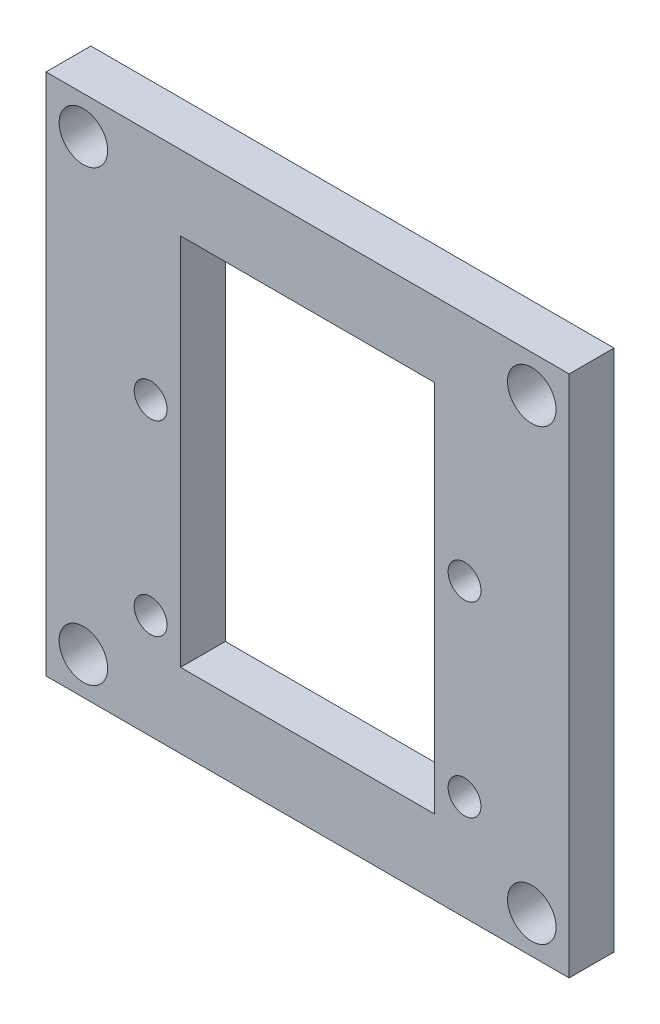
ISO-10303-21;
HEADER;
FILE_DESCRIPTION(('STEP AP214'),'2;1');
FILE_NAME('part.step','',(''),(''),'','','');
FILE_SCHEMA(('AUTOMOTIVE_DESIGN { 1 0 10303 214 1 1 1 1 }'));
ENDSEC;
DATA;
#1=APPLICATION_CONTEXT('core data for automotive mechanical design processes');
#2=APPLICATION_PROTOCOL_DEFINITION('international standard','automotive_design',2000,#1);
#3=PRODUCT_CONTEXT('',#1,'mechanical');
#4=PRODUCT('Part','Part','',(#3));
#5=PRODUCT_RELATED_PRODUCT_CATEGORY('part','',(#4));
#6=PRODUCT_DEFINITION_FORMATION('','',#4);
#7=PRODUCT_DEFINITION_CONTEXT('part definition',#1,'design');
#8=PRODUCT_DEFINITION('design','',#6,#7);
#9=PRODUCT_DEFINITION_SHAPE('','',#8);
#10=(LENGTH_UNIT() NAMED_UNIT(*) SI_UNIT(.MILLI.,.METRE.));
#11=(NAMED_UNIT(*) PLANE_ANGLE_UNIT() SI_UNIT($,.RADIAN.));
#12=(NAMED_UNIT(*) SI_UNIT($,.STERADIAN.) SOLID_ANGLE_UNIT());
#13=UNCERTAINTY_MEASURE_WITH_UNIT(LENGTH_MEASURE(1.E-05),#10,'distance_accuracy_value','');
#14=(GEOMETRIC_REPRESENTATION_CONTEXT(3) GLOBAL_UNCERTAINTY_ASSIGNED_CONTEXT((#13)) GLOBAL_UNIT_ASSIGNED_CONTEXT((#10,
#11,#12)) REPRESENTATION_CONTEXT('',''));
#15=CARTESIAN_POINT('',(0.,0.,0.));
#16=DIRECTION('',(0.,0.,1.));
#17=DIRECTION('',(1.,0.,0.));
#18=AXIS2_PLACEMENT_3D('',#15,#16,#17);
#19=CARTESIAN_POINT('',(0.,-5.,3.));
#20=DIRECTION('',(0.,1.,0.));
#21=DIRECTION('',(0.,0.,1.));
#22=AXIS2_PLACEMENT_3D('',#19,#20,#21);
#23=PLANE('',#22);
#24=DIRECTION('',(1.,0.,0.));
#25=VECTOR('',#24,1.);
#26=CARTESIAN_POINT('',(0.,-5.,0.));
#27=LINE('',#26,#25);
#28=CARTESIAN_POINT('',(-5.,-5.,0.));
#29=VERTEX_POINT('',#28);
#30=CARTESIAN_POINT('',(30.,-5.,0.));
#31=VERTEX_POINT('',#30);
#32=EDGE_CURVE('E196',#29,#31,#27,.T.);
#33=ORIENTED_EDGE('',*,*,#32,.T.);
#34=DIRECTION('',(0.,0.,-1.));
#35=VECTOR('',#34,1.);
#36=CARTESIAN_POINT('',(30.,-5.,3.));
#37=LINE('',#36,#35);
#38=CARTESIAN_POINT('',(30.,-5.,3.));
#39=VERTEX_POINT('',#38);
#40=EDGE_CURVE('E11',#39,#31,#37,.T.);
#41=ORIENTED_EDGE('',*,*,#40,.F.);
#42=DIRECTION('',(1.,0.,0.));
#43=VECTOR('',#42,1.);
#44=CARTESIAN_POINT('',(0.,-5.,3.));
#45=LINE('',#44,#43);
#46=CARTESIAN_POINT('',(-5.,-5.,3.));
#47=VERTEX_POINT('',#46);
#48=EDGE_CURVE('E128',#47,#39,#45,.T.);
#49=ORIENTED_EDGE('',*,*,#48,.F.);
#50=DIRECTION('',(0.,0.,-1.));
#51=VECTOR('',#50,1.);
#52=CARTESIAN_POINT('',(-5.,-5.,3.));
#53=LINE('',#52,#51);
#54=EDGE_CURVE('E67',#47,#29,#53,.T.);
#55=ORIENTED_EDGE('',*,*,#54,.T.);
#56=EDGE_LOOP('',(#33,#41,#49,#55));
#57=FACE_BOUND('',#56,.T.);
#58=ADVANCED_FACE('F47',(#57),#23,.F.);
#59=CARTESIAN_POINT('',(30.,0.,3.));
#60=DIRECTION('',(-1.,0.,0.));
#61=DIRECTION('',(0.,0.,1.));
#62=AXIS2_PLACEMENT_3D('',#59,#60,#61);
#63=PLANE('',#62);
#64=DIRECTION('',(0.,1.,0.));
#65=VECTOR('',#64,1.);
#66=CARTESIAN_POINT('',(30.,0.,0.));
#67=LINE('',#66,#65);
#68=CARTESIAN_POINT('',(30.,30.,0.));
#69=VERTEX_POINT('',#68);
#70=EDGE_CURVE('E135',#31,#69,#67,.T.);
#71=ORIENTED_EDGE('',*,*,#70,.T.);
#72=DIRECTION('',(0.,0.,-1.));
#73=VECTOR('',#72,1.);
#74=CARTESIAN_POINT('',(30.,30.,3.));
#75=LINE('',#74,#73);
#76=CARTESIAN_POINT('',(30.,30.,3.));
#77=VERTEX_POINT('',#76);
#78=EDGE_CURVE('E58',#77,#69,#75,.T.);
#79=ORIENTED_EDGE('',*,*,#78,.F.);
#80=DIRECTION('',(0.,1.,0.));
#81=VECTOR('',#80,1.);
#82=CARTESIAN_POINT('',(30.,0.,3.));
#83=LINE('',#82,#81);
#84=EDGE_CURVE('E121',#39,#77,#83,.T.);
#85=ORIENTED_EDGE('',*,*,#84,.F.);
#86=ORIENTED_EDGE('',*,*,#40,.T.);
#87=EDGE_LOOP('',(#71,#79,#85,#86));
#88=FACE_BOUND('',#87,.T.);
#89=ADVANCED_FACE('F134',(#88),#63,.F.);
#90=CARTESIAN_POINT('',(0.,30.,3.));
#91=DIRECTION('',(0.,1.,0.));
#92=DIRECTION('',(0.,0.,1.));
#93=AXIS2_PLACEMENT_3D('',#90,#91,#92);
#94=PLANE('',#93);
#95=DIRECTION('',(1.,0.,0.));
#96=VECTOR('',#95,1.);
#97=CARTESIAN_POINT('',(0.,30.,0.));
#98=LINE('',#97,#96);
#99=CARTESIAN_POINT('',(-5.,30.,0.));
#100=VERTEX_POINT('',#99);
#101=EDGE_CURVE('E201',#100,#69,#98,.T.);
#102=ORIENTED_EDGE('',*,*,#101,.F.);
#103=DIRECTION('',(0.,0.,-1.));
#104=VECTOR('',#103,1.);
#105=CARTESIAN_POINT('',(-5.,30.,3.));
#106=LINE('',#105,#104);
#107=CARTESIAN_POINT('',(-5.,30.,3.));
#108=VERTEX_POINT('',#107);
#109=EDGE_CURVE('E93',#108,#100,#106,.T.);
#110=ORIENTED_EDGE('',*,*,#109,.F.);
#111=DIRECTION('',(1.,0.,0.));
#112=VECTOR('',#111,1.);
#113=CARTESIAN_POINT('',(0.,30.,3.));
#114=LINE('',#113,#112);
#115=EDGE_CURVE('E127',#108,#77,#114,.T.);
#116=ORIENTED_EDGE('',*,*,#115,.T.);
#117=ORIENTED_EDGE('',*,*,#78,.T.);
#118=EDGE_LOOP('',(#102,#110,#116,#117));
#119=FACE_BOUND('',#118,.T.);
#120=ADVANCED_FACE('F140',(#119),#94,.T.);
#121=CARTESIAN_POINT('',(0.,0.,3.));
#122=DIRECTION('',(0.,1.,0.));
#123=DIRECTION('',(-1.,0.,0.));
#124=AXIS2_PLACEMENT_3D('',#121,#122,#123);
#125=PLANE('',#124);
#126=DIRECTION('',(1.,0.,0.));
#127=VECTOR('',#126,1.);
#128=CARTESIAN_POINT('',(0.,0.,0.));
#129=LINE('',#128,#127);
#130=CARTESIAN_POINT('',(4.,0.,0.));
#131=VERTEX_POINT('',#130);
#132=CARTESIAN_POINT('',(21.,0.,0.));
#133=VERTEX_POINT('',#132);
#134=EDGE_CURVE('E165',#131,#133,#129,.T.);
#135=ORIENTED_EDGE('',*,*,#134,.F.);
#136=DIRECTION('',(0.,0.,-1.));
#137=VECTOR('',#136,1.);
#138=CARTESIAN_POINT('',(4.,0.,3.));
#139=LINE('',#138,#137);
#140=CARTESIAN_POINT('',(4.,0.,3.));
#141=VERTEX_POINT('',#140);
#142=EDGE_CURVE('E51',#141,#131,#139,.T.);
#143=ORIENTED_EDGE('',*,*,#142,.F.);
#144=DIRECTION('',(1.,0.,0.));
#145=VECTOR('',#144,1.);
#146=CARTESIAN_POINT('',(0.,0.,3.));
#147=LINE('',#146,#145);
#148=CARTESIAN_POINT('',(21.,0.,3.));
#149=VERTEX_POINT('',#148);
#150=EDGE_CURVE('E224',#141,#149,#147,.T.);
#151=ORIENTED_EDGE('',*,*,#150,.T.);
#152=DIRECTION('',(0.,0.,-1.));
#153=VECTOR('',#152,1.);
#154=CARTESIAN_POINT('',(21.,0.,3.));
#155=LINE('',#154,#153);
#156=EDGE_CURVE('E164',#149,#133,#155,.T.);
#157=ORIENTED_EDGE('',*,*,#156,.T.);
#158=EDGE_LOOP('',(#135,#143,#151,#157));
#159=FACE_BOUND('',#158,.T.);
#160=ADVANCED_FACE('F49',(#159),#125,.T.);
#161=CARTESIAN_POINT('',(4.,0.,3.));
#162=DIRECTION('',(1.,0.,0.));
#163=DIRECTION('',(0.,1.,0.));
#164=AXIS2_PLACEMENT_3D('',#161,#162,#163);
#165=PLANE('',#164);
#166=DIRECTION('',(0.,-1.,0.));
#167=VECTOR('',#166,1.);
#168=CARTESIAN_POINT('',(4.,0.,0.));
#169=LINE('',#168,#167);
#170=CARTESIAN_POINT('',(4.,25.,0.));
#171=VERTEX_POINT('',#170);
#172=EDGE_CURVE('E169',#171,#131,#169,.T.);
#173=ORIENTED_EDGE('',*,*,#172,.F.);
#174=DIRECTION('',(0.,0.,-1.));
#175=VECTOR('',#174,1.);
#176=CARTESIAN_POINT('',(4.,25.,3.));
#177=LINE('',#176,#175);
#178=CARTESIAN_POINT('',(4.,25.,3.));
#179=VERTEX_POINT('',#178);
#180=EDGE_CURVE('E234',#179,#171,#177,.T.);
#181=ORIENTED_EDGE('',*,*,#180,.F.);
#182=DIRECTION('',(0.,-1.,0.));
#183=VECTOR('',#182,1.);
#184=CARTESIAN_POINT('',(4.,0.,3.));
#185=LINE('',#184,#183);
#186=EDGE_CURVE('E245',#179,#141,#185,.T.);
#187=ORIENTED_EDGE('',*,*,#186,.T.);
#188=ORIENTED_EDGE('',*,*,#142,.T.);
#189=EDGE_LOOP('',(#173,#181,#187,#188));
#190=FACE_BOUND('',#189,.T.);
#191=ADVANCED_FACE('F243',(#190),#165,.T.);
#192=CARTESIAN_POINT('',(0.,25.,3.));
#193=DIRECTION('',(0.,1.,0.));
#194=DIRECTION('',(-1.,0.,0.));
#195=AXIS2_PLACEMENT_3D('',#192,#193,#194);
#196=PLANE('',#195);
#197=DIRECTION('',(1.,0.,0.));
#198=VECTOR('',#197,1.);
#199=CARTESIAN_POINT('',(0.,25.,0.));
#200=LINE('',#199,#198);
#201=CARTESIAN_POINT('',(21.,25.,0.));
#202=VERTEX_POINT('',#201);
#203=EDGE_CURVE('E173',#171,#202,#200,.T.);
#204=ORIENTED_EDGE('',*,*,#203,.T.);
#205=DIRECTION('',(0.,0.,-1.));
#206=VECTOR('',#205,1.);
#207=CARTESIAN_POINT('',(21.,25.,3.));
#208=LINE('',#207,#206);
#209=CARTESIAN_POINT('',(21.,25.,3.));
#210=VERTEX_POINT('',#209);
#211=EDGE_CURVE('E231',#210,#202,#208,.T.);
#212=ORIENTED_EDGE('',*,*,#211,.F.);
#213=DIRECTION('',(1.,0.,0.));
#214=VECTOR('',#213,1.);
#215=CARTESIAN_POINT('',(0.,25.,3.));
#216=LINE('',#215,#214);
#217=EDGE_CURVE('E260',#179,#210,#216,.T.);
#218=ORIENTED_EDGE('',*,*,#217,.F.);
#219=ORIENTED_EDGE('',*,*,#180,.T.);
#220=EDGE_LOOP('',(#204,#212,#218,#219));
#221=FACE_BOUND('',#220,.T.);
#222=ADVANCED_FACE('F252',(#221),#196,.F.);
#223=CARTESIAN_POINT('',(2.,2.,3.));
#224=DIRECTION('',(0.,0.,-1.));
#225=DIRECTION('',(-1.,0.,0.));
#226=AXIS2_PLACEMENT_3D('',#223,#224,#225);
#227=CYLINDRICAL_SURFACE('',#226,1.1);
#228=CARTESIAN_POINT('',(2.,2.,3.));
#229=DIRECTION('',(0.,0.,1.));
#230=DIRECTION('',(1.,0.,0.));
#231=AXIS2_PLACEMENT_3D('',#228,#229,#230);
#232=CIRCLE('',#231,1.1);
#233=CARTESIAN_POINT('',(3.1,2.,3.));
#234=VERTEX_POINT('',#233);
#235=EDGE_CURVE('E156',#234,#234,#232,.T.);
#236=ORIENTED_EDGE('',*,*,#235,.T.);
#237=EDGE_LOOP('',(#236));
#238=FACE_BOUND('',#237,.T.);
#239=CARTESIAN_POINT('',(2.,2.,0.));
#240=DIRECTION('',(0.,0.,1.));
#241=DIRECTION('',(1.,0.,0.));
#242=AXIS2_PLACEMENT_3D('',#239,#240,#241);
#243=CIRCLE('',#242,1.1);
#244=CARTESIAN_POINT('',(3.1,2.,0.));
#245=VERTEX_POINT('',#244);
#246=EDGE_CURVE('E216',#245,#245,#243,.T.);
#247=ORIENTED_EDGE('',*,*,#246,.F.);
#248=EDGE_LOOP('',(#247));
#249=FACE_BOUND('',#248,.T.);
#250=ADVANCED_FACE('F323',(#238,#249),#227,.F.);
#251=CARTESIAN_POINT('',(-2.5,-2.5,3.));
#252=DIRECTION('',(0.,0.,-1.));
#253=DIRECTION('',(-1.,0.,0.));
#254=AXIS2_PLACEMENT_3D('',#251,#252,#253);
#255=CYLINDRICAL_SURFACE('',#254,1.62428156146417);
#256=CARTESIAN_POINT('',(-2.5,-2.5,3.));
#257=DIRECTION('',(0.,0.,1.));
#258=DIRECTION('',(1.,0.,0.));
#259=AXIS2_PLACEMENT_3D('',#256,#257,#258);
#260=CIRCLE('',#259,1.62428156146417);
#261=CARTESIAN_POINT('',(-0.875718438535833,-2.5,3.));
#262=VERTEX_POINT('',#261);
#263=EDGE_CURVE('E152',#262,#262,#260,.F.);
#264=ORIENTED_EDGE('',*,*,#263,.F.);
#265=EDGE_LOOP('',(#264));
#266=FACE_BOUND('',#265,.T.);
#267=CARTESIAN_POINT('',(-2.5,-2.5,0.));
#268=DIRECTION('',(0.,0.,1.));
#269=DIRECTION('',(1.,0.,0.));
#270=AXIS2_PLACEMENT_3D('',#267,#268,#269);
#271=CIRCLE('',#270,1.62428156146417);
#272=CARTESIAN_POINT('',(-0.875718438535833,-2.5,0.));
#273=VERTEX_POINT('',#272);
#274=EDGE_CURVE('E212',#273,#273,#271,.F.);
#275=ORIENTED_EDGE('',*,*,#274,.T.);
#276=EDGE_LOOP('',(#275));
#277=FACE_BOUND('',#276,.T.);
#278=ADVANCED_FACE('F339',(#266,#277),#255,.F.);
#279=CARTESIAN_POINT('',(27.5,-2.50000000000001,3.));
#280=DIRECTION('',(0.,0.,-1.));
#281=DIRECTION('',(-1.,0.,0.));
#282=AXIS2_PLACEMENT_3D('',#279,#280,#281);
#283=CYLINDRICAL_SURFACE('',#282,1.62428156146417);
#284=CARTESIAN_POINT('',(27.5,-2.50000000000001,3.));
#285=DIRECTION('',(0.,0.,1.));
#286=DIRECTION('',(1.,0.,0.));
#287=AXIS2_PLACEMENT_3D('',#284,#285,#286);
#288=CIRCLE('',#287,1.62428156146417);
#289=CARTESIAN_POINT('',(29.1242815614642,-2.50000000000001,3.));
#290=VERTEX_POINT('',#289);
#291=EDGE_CURVE('E145',#290,#290,#288,.T.);
#292=ORIENTED_EDGE('',*,*,#291,.T.);
#293=EDGE_LOOP('',(#292));
#294=FACE_BOUND('',#293,.T.);
#295=CARTESIAN_POINT('',(27.5,-2.50000000000001,0.));
#296=DIRECTION('',(0.,0.,1.));
#297=DIRECTION('',(1.,0.,0.));
#298=AXIS2_PLACEMENT_3D('',#295,#296,#297);
#299=CIRCLE('',#298,1.62428156146417);
#300=CARTESIAN_POINT('',(29.1242815614642,-2.50000000000001,0.));
#301=VERTEX_POINT('',#300);
#302=EDGE_CURVE('E208',#301,#301,#299,.T.);
#303=ORIENTED_EDGE('',*,*,#302,.F.);
#304=EDGE_LOOP('',(#303));
#305=FACE_BOUND('',#304,.T.);
#306=ADVANCED_FACE('F336',(#294,#305),#283,.F.);
#307=CARTESIAN_POINT('',(-5.,0.,3.));
#308=DIRECTION('',(-1.,0.,0.));
#309=DIRECTION('',(0.,0.,1.));
#310=AXIS2_PLACEMENT_3D('',#307,#308,#309);
#311=PLANE('',#310);
#312=DIRECTION('',(0.,1.,0.));
#313=VECTOR('',#312,1.);
#314=CARTESIAN_POINT('',(-5.,0.,0.));
#315=LINE('',#314,#313);
#316=EDGE_CURVE('E204',#29,#100,#315,.T.);
#317=ORIENTED_EDGE('',*,*,#316,.F.);
#318=ORIENTED_EDGE('',*,*,#54,.F.);
#319=DIRECTION('',(0.,1.,0.));
#320=VECTOR('',#319,1.);
#321=CARTESIAN_POINT('',(-5.,0.,3.));
#322=LINE('',#321,#320);
#323=EDGE_CURVE('E142',#47,#108,#322,.T.);
#324=ORIENTED_EDGE('',*,*,#323,.T.);
#325=ORIENTED_EDGE('',*,*,#109,.T.);
#326=EDGE_LOOP('',(#317,#318,#324,#325));
#327=FACE_BOUND('',#326,.T.);
#328=ADVANCED_FACE('F308',(#327),#311,.T.);
#329=CARTESIAN_POINT('',(-2.5,27.5,3.));
#330=DIRECTION('',(0.,0.,-1.));
#331=DIRECTION('',(-1.,0.,0.));
#332=AXIS2_PLACEMENT_3D('',#329,#330,#331);
#333=CYLINDRICAL_SURFACE('',#332,1.62428156146417);
#334=CARTESIAN_POINT('',(-2.5,27.5,3.));
#335=DIRECTION('',(0.,0.,1.));
#336=DIRECTION('',(1.,0.,0.));
#337=AXIS2_PLACEMENT_3D('',#334,#335,#336);
#338=CIRCLE('',#337,1.62428156146417);
#339=CARTESIAN_POINT('',(-0.875718438535833,27.5,3.));
#340=VERTEX_POINT('',#339);
#341=EDGE_CURVE('E277',#340,#340,#338,.T.);
#342=ORIENTED_EDGE('',*,*,#341,.T.);
#343=EDGE_LOOP('',(#342));
#344=FACE_BOUND('',#343,.T.);
#345=CARTESIAN_POINT('',(-2.5,27.5,0.));
#346=DIRECTION('',(0.,0.,1.));
#347=DIRECTION('',(1.,0.,0.));
#348=AXIS2_PLACEMENT_3D('',#345,#346,#347);
#349=CIRCLE('',#348,1.62428156146417);
#350=CARTESIAN_POINT('',(-0.875718438535833,27.5,0.));
#351=VERTEX_POINT('',#350);
#352=EDGE_CURVE('E192',#351,#351,#349,.T.);
#353=ORIENTED_EDGE('',*,*,#352,.F.);
#354=EDGE_LOOP('',(#353));
#355=FACE_BOUND('',#354,.T.);
#356=ADVANCED_FACE('F283',(#344,#355),#333,.F.);
#357=CARTESIAN_POINT('',(27.5,27.5,3.));
#358=DIRECTION('',(0.,0.,-1.));
#359=DIRECTION('',(-1.,0.,0.));
#360=AXIS2_PLACEMENT_3D('',#357,#358,#359);
#361=CYLINDRICAL_SURFACE('',#360,1.62428156146417);
#362=CARTESIAN_POINT('',(27.5,27.5,3.));
#363=DIRECTION('',(0.,0.,1.));
#364=DIRECTION('',(1.,0.,0.));
#365=AXIS2_PLACEMENT_3D('',#362,#363,#364);
#366=CIRCLE('',#365,1.62428156146417);
#367=CARTESIAN_POINT('',(29.1242815614642,27.5,3.));
#368=VERTEX_POINT('',#367);
#369=EDGE_CURVE('E273',#368,#368,#366,.F.);
#370=ORIENTED_EDGE('',*,*,#369,.F.);
#371=EDGE_LOOP('',(#370));
#372=FACE_BOUND('',#371,.T.);
#373=CARTESIAN_POINT('',(27.5,27.5,0.));
#374=DIRECTION('',(0.,0.,1.));
#375=DIRECTION('',(1.,0.,0.));
#376=AXIS2_PLACEMENT_3D('',#373,#374,#375);
#377=CIRCLE('',#376,1.62428156146417);
#378=CARTESIAN_POINT('',(29.1242815614642,27.5,0.));
#379=VERTEX_POINT('',#378);
#380=EDGE_CURVE('E188',#379,#379,#377,.F.);
#381=ORIENTED_EDGE('',*,*,#380,.T.);
#382=EDGE_LOOP('',(#381));
#383=FACE_BOUND('',#382,.T.);
#384=ADVANCED_FACE('F307',(#372,#383),#361,.F.);
#385=CARTESIAN_POINT('',(23.,14.5,3.));
#386=DIRECTION('',(0.,0.,-1.));
#387=DIRECTION('',(-1.,0.,0.));
#388=AXIS2_PLACEMENT_3D('',#385,#386,#387);
#389=CYLINDRICAL_SURFACE('',#388,1.1);
#390=CARTESIAN_POINT('',(23.,14.5,3.));
#391=DIRECTION('',(0.,0.,1.));
#392=DIRECTION('',(1.,0.,0.));
#393=AXIS2_PLACEMENT_3D('',#390,#391,#392);
#394=CIRCLE('',#393,1.1);
#395=CARTESIAN_POINT('',(24.1,14.5,3.));
#396=VERTEX_POINT('',#395);
#397=EDGE_CURVE('E265',#396,#396,#394,.F.);
#398=ORIENTED_EDGE('',*,*,#397,.F.);
#399=EDGE_LOOP('',(#398));
#400=FACE_BOUND('',#399,.T.);
#401=CARTESIAN_POINT('',(23.,14.5,0.));
#402=DIRECTION('',(0.,0.,1.));
#403=DIRECTION('',(1.,0.,0.));
#404=AXIS2_PLACEMENT_3D('',#401,#402,#403);
#405=CIRCLE('',#404,1.1);
#406=CARTESIAN_POINT('',(24.1,14.5,0.));
#407=VERTEX_POINT('',#406);
#408=EDGE_CURVE('E184',#407,#407,#405,.F.);
#409=ORIENTED_EDGE('',*,*,#408,.T.);
#410=EDGE_LOOP('',(#409));
#411=FACE_BOUND('',#410,.T.);
#412=ADVANCED_FACE('F311',(#400,#411),#389,.F.);
#413=CARTESIAN_POINT('',(23.,2.,3.));
#414=DIRECTION('',(0.,0.,-1.));
#415=DIRECTION('',(-1.,0.,0.));
#416=AXIS2_PLACEMENT_3D('',#413,#414,#415);
#417=CYLINDRICAL_SURFACE('',#416,1.1);
#418=CARTESIAN_POINT('',(23.,2.,3.));
#419=DIRECTION('',(0.,0.,1.));
#420=DIRECTION('',(1.,0.,0.));
#421=AXIS2_PLACEMENT_3D('',#418,#419,#420);
#422=CIRCLE('',#421,1.1);
#423=CARTESIAN_POINT('',(24.1,2.,3.));
#424=VERTEX_POINT('',#423);
#425=EDGE_CURVE('E259',#424,#424,#422,.F.);
#426=ORIENTED_EDGE('',*,*,#425,.F.);
#427=EDGE_LOOP('',(#426));
#428=FACE_BOUND('',#427,.T.);
#429=CARTESIAN_POINT('',(23.,2.,0.));
#430=DIRECTION('',(0.,0.,1.));
#431=DIRECTION('',(1.,0.,0.));
#432=AXIS2_PLACEMENT_3D('',#429,#430,#431);
#433=CIRCLE('',#432,1.1);
#434=CARTESIAN_POINT('',(24.1,2.,0.));
#435=VERTEX_POINT('',#434);
#436=EDGE_CURVE('E180',#435,#435,#433,.F.);
#437=ORIENTED_EDGE('',*,*,#436,.T.);
#438=EDGE_LOOP('',(#437));
#439=FACE_BOUND('',#438,.T.);
#440=ADVANCED_FACE('F315',(#428,#439),#417,.F.);
#441=CARTESIAN_POINT('',(21.,0.,3.));
#442=DIRECTION('',(1.,0.,0.));
#443=DIRECTION('',(0.,1.,0.));
#444=AXIS2_PLACEMENT_3D('',#441,#442,#443);
#445=PLANE('',#444);
#446=DIRECTION('',(0.,-1.,0.));
#447=VECTOR('',#446,1.);
#448=CARTESIAN_POINT('',(21.,0.,0.));
#449=LINE('',#448,#447);
#450=EDGE_CURVE('E176',#202,#133,#449,.T.);
#451=ORIENTED_EDGE('',*,*,#450,.T.);
#452=ORIENTED_EDGE('',*,*,#156,.F.);
#453=DIRECTION('',(0.,-1.,0.));
#454=VECTOR('',#453,1.);
#455=CARTESIAN_POINT('',(21.,0.,3.));
#456=LINE('',#455,#454);
#457=EDGE_CURVE('E256',#210,#149,#456,.T.);
#458=ORIENTED_EDGE('',*,*,#457,.F.);
#459=ORIENTED_EDGE('',*,*,#211,.T.);
#460=EDGE_LOOP('',(#451,#452,#458,#459));
#461=FACE_BOUND('',#460,.T.);
#462=ADVANCED_FACE('F255',(#461),#445,.F.);
#463=CARTESIAN_POINT('',(2.,14.5,3.));
#464=DIRECTION('',(0.,0.,-1.));
#465=DIRECTION('',(-1.,0.,0.));
#466=AXIS2_PLACEMENT_3D('',#463,#464,#465);
#467=CYLINDRICAL_SURFACE('',#466,1.1);
#468=CARTESIAN_POINT('',(2.,14.5,3.));
#469=DIRECTION('',(0.,0.,1.));
#470=DIRECTION('',(1.,0.,0.));
#471=AXIS2_PLACEMENT_3D('',#468,#469,#470);
#472=CIRCLE('',#471,1.1);
#473=CARTESIAN_POINT('',(3.1,14.5,3.));
#474=VERTEX_POINT('',#473);
#475=EDGE_CURVE('E160',#474,#474,#472,.T.);
#476=ORIENTED_EDGE('',*,*,#475,.T.);
#477=EDGE_LOOP('',(#476));
#478=FACE_BOUND('',#477,.T.);
#479=CARTESIAN_POINT('',(2.,14.5,0.));
#480=DIRECTION('',(0.,0.,1.));
#481=DIRECTION('',(1.,0.,0.));
#482=AXIS2_PLACEMENT_3D('',#479,#480,#481);
#483=CIRCLE('',#482,1.1);
#484=CARTESIAN_POINT('',(3.1,14.5,0.));
#485=VERTEX_POINT('',#484);
#486=EDGE_CURVE('E220',#485,#485,#483,.T.);
#487=ORIENTED_EDGE('',*,*,#486,.F.);
#488=EDGE_LOOP('',(#487));
#489=FACE_BOUND('',#488,.T.);
#490=ADVANCED_FACE('F287',(#478,#489),#467,.F.);
#491=CARTESIAN_POINT('',(0.,0.,3.));
#492=DIRECTION('',(0.,0.,1.));
#493=DIRECTION('',(1.,0.,0.));
#494=AXIS2_PLACEMENT_3D('',#491,#492,#493);
#495=PLANE('',#494);
#496=ORIENTED_EDGE('',*,*,#150,.F.);
#497=ORIENTED_EDGE('',*,*,#186,.F.);
#498=ORIENTED_EDGE('',*,*,#217,.T.);
#499=ORIENTED_EDGE('',*,*,#457,.T.);
#500=EDGE_LOOP('',(#496,#497,#498,#499));
#501=FACE_BOUND('',#500,.T.);
#502=ORIENTED_EDGE('',*,*,#425,.T.);
#503=EDGE_LOOP('',(#502));
#504=FACE_BOUND('',#503,.T.);
#505=ORIENTED_EDGE('',*,*,#397,.T.);
#506=EDGE_LOOP('',(#505));
#507=FACE_BOUND('',#506,.T.);
#508=ORIENTED_EDGE('',*,*,#369,.T.);
#509=EDGE_LOOP('',(#508));
#510=FACE_BOUND('',#509,.T.);
#511=ORIENTED_EDGE('',*,*,#341,.F.);
#512=EDGE_LOOP('',(#511));
#513=FACE_BOUND('',#512,.T.);
#514=ORIENTED_EDGE('',*,*,#48,.T.);
#515=ORIENTED_EDGE('',*,*,#84,.T.);
#516=ORIENTED_EDGE('',*,*,#115,.F.);
#517=ORIENTED_EDGE('',*,*,#323,.F.);
#518=EDGE_LOOP('',(#514,#515,#516,#517));
#519=FACE_BOUND('',#518,.T.);
#520=ORIENTED_EDGE('',*,*,#291,.F.);
#521=EDGE_LOOP('',(#520));
#522=FACE_BOUND('',#521,.T.);
#523=ORIENTED_EDGE('',*,*,#263,.T.);
#524=EDGE_LOOP('',(#523));
#525=FACE_BOUND('',#524,.T.);
#526=ORIENTED_EDGE('',*,*,#235,.F.);
#527=EDGE_LOOP('',(#526));
#528=FACE_BOUND('',#527,.T.);
#529=ORIENTED_EDGE('',*,*,#475,.F.);
#530=EDGE_LOOP('',(#529));
#531=FACE_BOUND('',#530,.T.);
#532=ADVANCED_FACE('F123',(#501,#504,#507,#510,#513,#519,#522,#525,#528,#531),#495,.T.);
#533=CARTESIAN_POINT('',(0.,0.,0.));
#534=DIRECTION('',(0.,0.,1.));
#535=DIRECTION('',(1.,0.,0.));
#536=AXIS2_PLACEMENT_3D('',#533,#534,#535);
#537=PLANE('',#536);
#538=ORIENTED_EDGE('',*,*,#134,.T.);
#539=ORIENTED_EDGE('',*,*,#450,.F.);
#540=ORIENTED_EDGE('',*,*,#203,.F.);
#541=ORIENTED_EDGE('',*,*,#172,.T.);
#542=EDGE_LOOP('',(#538,#539,#540,#541));
#543=FACE_BOUND('',#542,.T.);
#544=ORIENTED_EDGE('',*,*,#436,.F.);
#545=EDGE_LOOP('',(#544));
#546=FACE_BOUND('',#545,.T.);
#547=ORIENTED_EDGE('',*,*,#408,.F.);
#548=EDGE_LOOP('',(#547));
#549=FACE_BOUND('',#548,.T.);
#550=ORIENTED_EDGE('',*,*,#380,.F.);
#551=EDGE_LOOP('',(#550));
#552=FACE_BOUND('',#551,.T.);
#553=ORIENTED_EDGE('',*,*,#352,.T.);
#554=EDGE_LOOP('',(#553));
#555=FACE_BOUND('',#554,.T.);
#556=ORIENTED_EDGE('',*,*,#32,.F.);
#557=ORIENTED_EDGE('',*,*,#316,.T.);
#558=ORIENTED_EDGE('',*,*,#101,.T.);
#559=ORIENTED_EDGE('',*,*,#70,.F.);
#560=EDGE_LOOP('',(#556,#557,#558,#559));
#561=FACE_BOUND('',#560,.T.);
#562=ORIENTED_EDGE('',*,*,#302,.T.);
#563=EDGE_LOOP('',(#562));
#564=FACE_BOUND('',#563,.T.);
#565=ORIENTED_EDGE('',*,*,#274,.F.);
#566=EDGE_LOOP('',(#565));
#567=FACE_BOUND('',#566,.T.);
#568=ORIENTED_EDGE('',*,*,#246,.T.);
#569=EDGE_LOOP('',(#568));
#570=FACE_BOUND('',#569,.T.);
#571=ORIENTED_EDGE('',*,*,#486,.T.);
#572=EDGE_LOOP('',(#571));
#573=FACE_BOUND('',#572,.T.);
#574=ADVANCED_FACE('F249',(#543,#546,#549,#552,#555,#561,#564,#567,#570,#573),#537,.F.);
#575=CLOSED_SHELL('',(#58,#89,#120,#160,#191,#222,#250,#278,#306,#328,#356,#384,#412,#440,#462,
#490,#532,#574));
#576=MANIFOLD_SOLID_BREP('B2',#575);
#577=ADVANCED_BREP_SHAPE_REPRESENTATION('',(#18,#576),#14);
#578=SHAPE_DEFINITION_REPRESENTATION(#9,#577);
ENDSEC;
END-ISO-10303-21;
